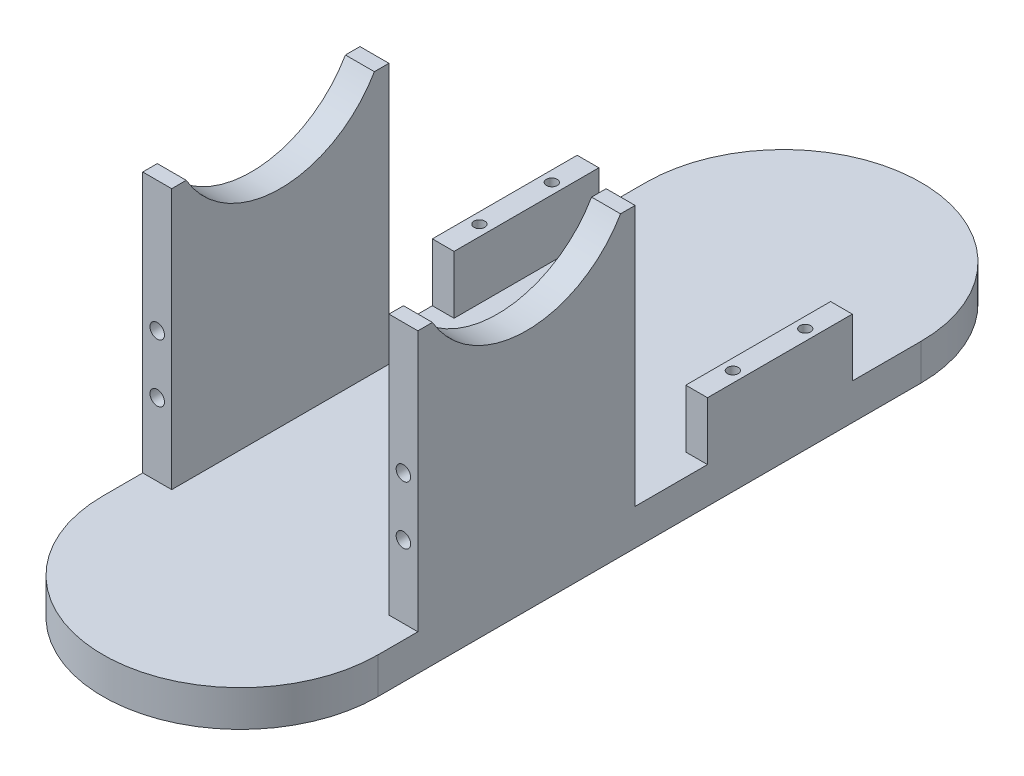
ISO-10303-21;
HEADER;
FILE_DESCRIPTION(('STEP AP214'),'2;1');
FILE_NAME('part.step','',(''),(''),'','','');
FILE_SCHEMA(('AUTOMOTIVE_DESIGN { 1 0 10303 214 1 1 1 1 }'));
ENDSEC;
DATA;
#1=APPLICATION_CONTEXT('core data for automotive mechanical design processes');
#2=APPLICATION_PROTOCOL_DEFINITION('international standard','automotive_design',2000,#1);
#3=PRODUCT_CONTEXT('',#1,'mechanical');
#4=PRODUCT('Part','Part','',(#3));
#5=PRODUCT_RELATED_PRODUCT_CATEGORY('part','',(#4));
#6=PRODUCT_DEFINITION_FORMATION('','',#4);
#7=PRODUCT_DEFINITION_CONTEXT('part definition',#1,'design');
#8=PRODUCT_DEFINITION('design','',#6,#7);
#9=PRODUCT_DEFINITION_SHAPE('','',#8);
#10=(LENGTH_UNIT() NAMED_UNIT(*) SI_UNIT(.MILLI.,.METRE.));
#11=(NAMED_UNIT(*) PLANE_ANGLE_UNIT() SI_UNIT($,.RADIAN.));
#12=(NAMED_UNIT(*) SI_UNIT($,.STERADIAN.) SOLID_ANGLE_UNIT());
#13=UNCERTAINTY_MEASURE_WITH_UNIT(LENGTH_MEASURE(1.E-05),#10,'distance_accuracy_value','');
#14=(GEOMETRIC_REPRESENTATION_CONTEXT(3) GLOBAL_UNCERTAINTY_ASSIGNED_CONTEXT((#13)) GLOBAL_UNIT_ASSIGNED_CONTEXT((#10,
#11,#12)) REPRESENTATION_CONTEXT('',''));
#15=CARTESIAN_POINT('',(0.,0.,0.));
#16=DIRECTION('',(0.,0.,1.));
#17=DIRECTION('',(1.,0.,0.));
#18=AXIS2_PLACEMENT_3D('',#15,#16,#17);
#19=CARTESIAN_POINT('',(0.,82.,0.));
#20=DIRECTION('',(0.,-1.,0.));
#21=DIRECTION('',(0.,0.,-1.));
#22=AXIS2_PLACEMENT_3D('',#19,#20,#21);
#23=PLANE('',#22);
#24=DIRECTION('',(0.,0.,1.));
#25=VECTOR('',#24,1.);
#26=CARTESIAN_POINT('',(-38.,82.,64.));
#27=LINE('',#26,#25);
#28=CARTESIAN_POINT('',(-38.,82.,4.));
#29=VERTEX_POINT('',#28);
#30=CARTESIAN_POINT('',(-38.0000000000001,82.,8.01923788646687));
#31=VERTEX_POINT('',#30);
#32=EDGE_CURVE('E245',#29,#31,#27,.T.);
#33=ORIENTED_EDGE('',*,*,#32,.T.);
#34=DIRECTION('',(1.,0.,0.));
#35=VECTOR('',#34,1.);
#36=CARTESIAN_POINT('',(-38.0000000000001,82.,8.01923788646687));
#37=LINE('',#36,#35);
#38=CARTESIAN_POINT('',(-30.,82.,8.01923788646687));
#39=VERTEX_POINT('',#38);
#40=EDGE_CURVE('E470',#31,#39,#37,.T.);
#41=ORIENTED_EDGE('',*,*,#40,.T.);
#42=DIRECTION('',(0.,0.,-1.));
#43=VECTOR('',#42,1.);
#44=CARTESIAN_POINT('',(-30.,82.,64.));
#45=LINE('',#44,#43);
#46=CARTESIAN_POINT('',(-30.,82.,4.));
#47=VERTEX_POINT('',#46);
#48=EDGE_CURVE('E251',#39,#47,#45,.T.);
#49=ORIENTED_EDGE('',*,*,#48,.T.);
#50=DIRECTION('',(-1.,0.,0.));
#51=VECTOR('',#50,1.);
#52=CARTESIAN_POINT('',(-38.,82.,4.));
#53=LINE('',#52,#51);
#54=EDGE_CURVE('E255',#47,#29,#53,.T.);
#55=ORIENTED_EDGE('',*,*,#54,.T.);
#56=EDGE_LOOP('',(#33,#41,#49,#55));
#57=FACE_BOUND('',#56,.T.);
#58=ADVANCED_FACE('F38',(#57),#23,.F.);
#59=CARTESIAN_POINT('',(0.,82.,0.));
#60=DIRECTION('',(0.,1.,0.));
#61=DIRECTION('',(0.,0.,1.));
#62=AXIS2_PLACEMENT_3D('',#59,#60,#61);
#63=PLANE('',#62);
#64=DIRECTION('',(1.,0.,0.));
#65=VECTOR('',#64,1.);
#66=CARTESIAN_POINT('',(-38.0000000000001,82.,59.9807621135332));
#67=LINE('',#66,#65);
#68=CARTESIAN_POINT('',(30.,82.,59.9807621135332));
#69=VERTEX_POINT('',#68);
#70=CARTESIAN_POINT('',(38.,82.,59.9807621135332));
#71=VERTEX_POINT('',#70);
#72=EDGE_CURVE('E11',#69,#71,#67,.T.);
#73=ORIENTED_EDGE('',*,*,#72,.F.);
#74=DIRECTION('',(0.,0.,1.));
#75=VECTOR('',#74,1.);
#76=CARTESIAN_POINT('',(30.,82.,64.));
#77=LINE('',#76,#75);
#78=CARTESIAN_POINT('',(30.,82.,64.));
#79=VERTEX_POINT('',#78);
#80=EDGE_CURVE('E218',#69,#79,#77,.T.);
#81=ORIENTED_EDGE('',*,*,#80,.T.);
#82=DIRECTION('',(1.,0.,0.));
#83=VECTOR('',#82,1.);
#84=CARTESIAN_POINT('',(38.,82.,64.));
#85=LINE('',#84,#83);
#86=CARTESIAN_POINT('',(38.,82.,64.));
#87=VERTEX_POINT('',#86);
#88=EDGE_CURVE('E214',#79,#87,#85,.T.);
#89=ORIENTED_EDGE('',*,*,#88,.T.);
#90=DIRECTION('',(0.,0.,-1.));
#91=VECTOR('',#90,1.);
#92=CARTESIAN_POINT('',(38.,82.,64.));
#93=LINE('',#92,#91);
#94=EDGE_CURVE('E207',#87,#71,#93,.T.);
#95=ORIENTED_EDGE('',*,*,#94,.T.);
#96=EDGE_LOOP('',(#73,#81,#89,#95));
#97=FACE_BOUND('',#96,.T.);
#98=ADVANCED_FACE('F212',(#97),#63,.T.);
#99=CARTESIAN_POINT('',(0.,10.,75.));
#100=DIRECTION('',(0.,1.,0.));
#101=DIRECTION('',(0.,0.,1.));
#102=AXIS2_PLACEMENT_3D('',#99,#100,#101);
#103=PLANE('',#102);
#104=DIRECTION('',(0.,0.,1.));
#105=VECTOR('',#104,1.);
#106=CARTESIAN_POINT('',(32.,10.,-16.));
#107=LINE('',#106,#105);
#108=CARTESIAN_POINT('',(32.,10.,-56.));
#109=VERTEX_POINT('',#108);
#110=CARTESIAN_POINT('',(32.,10.,-16.));
#111=VERTEX_POINT('',#110);
#112=EDGE_CURVE('E367',#109,#111,#107,.T.);
#113=ORIENTED_EDGE('',*,*,#112,.F.);
#114=DIRECTION('',(-1.,0.,0.));
#115=VECTOR('',#114,1.);
#116=CARTESIAN_POINT('',(38.,10.,-56.));
#117=LINE('',#116,#115);
#118=CARTESIAN_POINT('',(38.,10.,-56.));
#119=VERTEX_POINT('',#118);
#120=EDGE_CURVE('E350',#119,#109,#117,.T.);
#121=ORIENTED_EDGE('',*,*,#120,.F.);
#122=DIRECTION('',(0.,0.,-1.));
#123=VECTOR('',#122,1.);
#124=CARTESIAN_POINT('',(38.,10.,75.));
#125=LINE('',#124,#123);
#126=CARTESIAN_POINT('',(37.9999999999999,10.,-75.));
#127=VERTEX_POINT('',#126);
#128=EDGE_CURVE('E281',#119,#127,#125,.T.);
#129=ORIENTED_EDGE('',*,*,#128,.T.);
#130=CARTESIAN_POINT('',(0.,10.,-75.));
#131=DIRECTION('',(0.,1.,0.));
#132=DIRECTION('',(0.,0.,1.));
#133=AXIS2_PLACEMENT_3D('',#130,#131,#132);
#134=CIRCLE('',#133,38.);
#135=CARTESIAN_POINT('',(-38.,10.,-75.));
#136=VERTEX_POINT('',#135);
#137=EDGE_CURVE('E286',#127,#136,#134,.T.);
#138=ORIENTED_EDGE('',*,*,#137,.T.);
#139=DIRECTION('',(0.,0.,1.));
#140=VECTOR('',#139,1.);
#141=CARTESIAN_POINT('',(-38.,10.,75.));
#142=LINE('',#141,#140);
#143=CARTESIAN_POINT('',(-38.,10.,-56.));
#144=VERTEX_POINT('',#143);
#145=EDGE_CURVE('E290',#136,#144,#142,.T.);
#146=ORIENTED_EDGE('',*,*,#145,.T.);
#147=DIRECTION('',(-1.,0.,0.));
#148=VECTOR('',#147,1.);
#149=CARTESIAN_POINT('',(-38.,10.,-56.));
#150=LINE('',#149,#148);
#151=CARTESIAN_POINT('',(-32.,10.,-56.));
#152=VERTEX_POINT('',#151);
#153=EDGE_CURVE('E387',#152,#144,#150,.T.);
#154=ORIENTED_EDGE('',*,*,#153,.F.);
#155=DIRECTION('',(0.,0.,-1.));
#156=VECTOR('',#155,1.);
#157=CARTESIAN_POINT('',(-32.,10.,-16.));
#158=LINE('',#157,#156);
#159=CARTESIAN_POINT('',(-32.,10.,-16.));
#160=VERTEX_POINT('',#159);
#161=EDGE_CURVE('E396',#160,#152,#158,.T.);
#162=ORIENTED_EDGE('',*,*,#161,.F.);
#163=DIRECTION('',(1.,0.,0.));
#164=VECTOR('',#163,1.);
#165=CARTESIAN_POINT('',(-38.,10.,-16.));
#166=LINE('',#165,#164);
#167=CARTESIAN_POINT('',(-38.,10.,-16.));
#168=VERTEX_POINT('',#167);
#169=EDGE_CURVE('E382',#168,#160,#166,.T.);
#170=ORIENTED_EDGE('',*,*,#169,.F.);
#171=CARTESIAN_POINT('',(-38.,10.,4.));
#172=VERTEX_POINT('',#171);
#173=EDGE_CURVE('E293',#168,#172,#142,.T.);
#174=ORIENTED_EDGE('',*,*,#173,.T.);
#175=DIRECTION('',(-1.,0.,0.));
#176=VECTOR('',#175,1.);
#177=CARTESIAN_POINT('',(-38.,10.,4.));
#178=LINE('',#177,#176);
#179=CARTESIAN_POINT('',(-30.,10.,4.));
#180=VERTEX_POINT('',#179);
#181=EDGE_CURVE('E263',#180,#172,#178,.T.);
#182=ORIENTED_EDGE('',*,*,#181,.F.);
#183=DIRECTION('',(0.,0.,-1.));
#184=VECTOR('',#183,1.);
#185=CARTESIAN_POINT('',(-30.,10.,64.));
#186=LINE('',#185,#184);
#187=CARTESIAN_POINT('',(-30.,10.,64.));
#188=VERTEX_POINT('',#187);
#189=EDGE_CURVE('E260',#188,#180,#186,.T.);
#190=ORIENTED_EDGE('',*,*,#189,.F.);
#191=DIRECTION('',(1.,0.,0.));
#192=VECTOR('',#191,1.);
#193=CARTESIAN_POINT('',(-38.,10.,64.));
#194=LINE('',#193,#192);
#195=CARTESIAN_POINT('',(-38.,10.,64.));
#196=VERTEX_POINT('',#195);
#197=EDGE_CURVE('E244',#196,#188,#194,.T.);
#198=ORIENTED_EDGE('',*,*,#197,.F.);
#199=CARTESIAN_POINT('',(-38.,10.,75.));
#200=VERTEX_POINT('',#199);
#201=EDGE_CURVE('E289',#196,#200,#142,.T.);
#202=ORIENTED_EDGE('',*,*,#201,.T.);
#203=CARTESIAN_POINT('',(0.,10.,75.));
#204=DIRECTION('',(0.,1.,0.));
#205=DIRECTION('',(0.,0.,1.));
#206=AXIS2_PLACEMENT_3D('',#203,#204,#205);
#207=CIRCLE('',#206,38.);
#208=CARTESIAN_POINT('',(38.,10.,75.));
#209=VERTEX_POINT('',#208);
#210=EDGE_CURVE('E278',#200,#209,#207,.T.);
#211=ORIENTED_EDGE('',*,*,#210,.T.);
#212=CARTESIAN_POINT('',(38.,10.,64.));
#213=VERTEX_POINT('',#212);
#214=EDGE_CURVE('E283',#209,#213,#125,.T.);
#215=ORIENTED_EDGE('',*,*,#214,.T.);
#216=DIRECTION('',(1.,0.,0.));
#217=VECTOR('',#216,1.);
#218=CARTESIAN_POINT('',(38.,10.,64.));
#219=LINE('',#218,#217);
#220=CARTESIAN_POINT('',(30.,10.,64.));
#221=VERTEX_POINT('',#220);
#222=EDGE_CURVE('E220',#221,#213,#219,.T.);
#223=ORIENTED_EDGE('',*,*,#222,.F.);
#224=DIRECTION('',(0.,0.,1.));
#225=VECTOR('',#224,1.);
#226=CARTESIAN_POINT('',(30.,10.,64.));
#227=LINE('',#226,#225);
#228=CARTESIAN_POINT('',(30.,10.,4.00000000000001));
#229=VERTEX_POINT('',#228);
#230=EDGE_CURVE('E232',#229,#221,#227,.T.);
#231=ORIENTED_EDGE('',*,*,#230,.F.);
#232=DIRECTION('',(-1.,0.,0.));
#233=VECTOR('',#232,1.);
#234=CARTESIAN_POINT('',(38.,10.,4.));
#235=LINE('',#234,#233);
#236=CARTESIAN_POINT('',(38.,10.,4.));
#237=VERTEX_POINT('',#236);
#238=EDGE_CURVE('E230',#237,#229,#235,.T.);
#239=ORIENTED_EDGE('',*,*,#238,.F.);
#240=CARTESIAN_POINT('',(38.,10.,-16.));
#241=VERTEX_POINT('',#240);
#242=EDGE_CURVE('E287',#237,#241,#125,.T.);
#243=ORIENTED_EDGE('',*,*,#242,.T.);
#244=DIRECTION('',(1.,0.,0.));
#245=VECTOR('',#244,1.);
#246=CARTESIAN_POINT('',(38.,10.,-16.));
#247=LINE('',#246,#245);
#248=EDGE_CURVE('E354',#111,#241,#247,.T.);
#249=ORIENTED_EDGE('',*,*,#248,.F.);
#250=EDGE_LOOP('',(#113,#121,#129,#138,#146,#154,#162,#170,#174,#182,#190,#198,#202,#211,#215,
#223,#231,#239,#243,#249));
#251=FACE_BOUND('',#250,.T.);
#252=ADVANCED_FACE('F327',(#251),#103,.T.);
#253=CARTESIAN_POINT('',(0.,10.,75.));
#254=DIRECTION('',(0.,-1.,0.));
#255=DIRECTION('',(0.,0.,-1.));
#256=AXIS2_PLACEMENT_3D('',#253,#254,#255);
#257=CYLINDRICAL_SURFACE('',#256,38.);
#258=CARTESIAN_POINT('',(0.,0.,75.));
#259=DIRECTION('',(0.,1.,0.));
#260=DIRECTION('',(0.,0.,1.));
#261=AXIS2_PLACEMENT_3D('',#258,#259,#260);
#262=CIRCLE('',#261,38.);
#263=CARTESIAN_POINT('',(-38.,0.,75.));
#264=VERTEX_POINT('',#263);
#265=CARTESIAN_POINT('',(38.,0.,75.));
#266=VERTEX_POINT('',#265);
#267=EDGE_CURVE('E277',#264,#266,#262,.T.);
#268=ORIENTED_EDGE('',*,*,#267,.T.);
#269=DIRECTION('',(0.,-1.,0.));
#270=VECTOR('',#269,1.);
#271=CARTESIAN_POINT('',(38.,10.,75.));
#272=LINE('',#271,#270);
#273=EDGE_CURVE('E309',#209,#266,#272,.T.);
#274=ORIENTED_EDGE('',*,*,#273,.F.);
#275=ORIENTED_EDGE('',*,*,#210,.F.);
#276=DIRECTION('',(0.,-1.,0.));
#277=VECTOR('',#276,1.);
#278=CARTESIAN_POINT('',(-38.,10.,75.));
#279=LINE('',#278,#277);
#280=EDGE_CURVE('E292',#200,#264,#279,.T.);
#281=ORIENTED_EDGE('',*,*,#280,.T.);
#282=EDGE_LOOP('',(#268,#274,#275,#281));
#283=FACE_BOUND('',#282,.T.);
#284=ADVANCED_FACE('F40',(#283),#257,.T.);
#285=CARTESIAN_POINT('',(38.,10.,75.));
#286=DIRECTION('',(-1.,0.,0.));
#287=DIRECTION('',(0.,0.,1.));
#288=AXIS2_PLACEMENT_3D('',#285,#286,#287);
#289=PLANE('',#288);
#290=CARTESIAN_POINT('',(38.,82.,8.01923788646684));
#291=VERTEX_POINT('',#290);
#292=CARTESIAN_POINT('',(38.,82.,4.));
#293=VERTEX_POINT('',#292);
#294=EDGE_CURVE('E209',#291,#293,#93,.T.);
#295=ORIENTED_EDGE('',*,*,#294,.F.);
#296=CARTESIAN_POINT('',(38.,97.,34.));
#297=DIRECTION('',(1.,0.,0.));
#298=DIRECTION('',(0.,0.,-1.));
#299=AXIS2_PLACEMENT_3D('',#296,#297,#298);
#300=CIRCLE('',#299,30.);
#301=EDGE_CURVE('E60',#71,#291,#300,.T.);
#302=ORIENTED_EDGE('',*,*,#301,.F.);
#303=ORIENTED_EDGE('',*,*,#94,.F.);
#304=DIRECTION('',(0.,-1.,0.));
#305=VECTOR('',#304,1.);
#306=CARTESIAN_POINT('',(38.,82.,64.));
#307=LINE('',#306,#305);
#308=EDGE_CURVE('E229',#87,#213,#307,.T.);
#309=ORIENTED_EDGE('',*,*,#308,.T.);
#310=ORIENTED_EDGE('',*,*,#214,.F.);
#311=ORIENTED_EDGE('',*,*,#273,.T.);
#312=DIRECTION('',(0.,0.,-1.));
#313=VECTOR('',#312,1.);
#314=CARTESIAN_POINT('',(38.,0.,75.));
#315=LINE('',#314,#313);
#316=CARTESIAN_POINT('',(37.9999999999999,0.,-75.));
#317=VERTEX_POINT('',#316);
#318=EDGE_CURVE('E296',#266,#317,#315,.T.);
#319=ORIENTED_EDGE('',*,*,#318,.T.);
#320=DIRECTION('',(0.,-1.,0.));
#321=VECTOR('',#320,1.);
#322=CARTESIAN_POINT('',(37.9999999999999,10.,-75.));
#323=LINE('',#322,#321);
#324=EDGE_CURVE('E306',#127,#317,#323,.T.);
#325=ORIENTED_EDGE('',*,*,#324,.F.);
#326=ORIENTED_EDGE('',*,*,#128,.F.);
#327=DIRECTION('',(0.,-1.,0.));
#328=VECTOR('',#327,1.);
#329=CARTESIAN_POINT('',(38.,26.,-56.));
#330=LINE('',#329,#328);
#331=CARTESIAN_POINT('',(38.,26.,-56.));
#332=VERTEX_POINT('',#331);
#333=EDGE_CURVE('E380',#332,#119,#330,.T.);
#334=ORIENTED_EDGE('',*,*,#333,.F.);
#335=DIRECTION('',(0.,0.,-1.));
#336=VECTOR('',#335,1.);
#337=CARTESIAN_POINT('',(38.,26.,-16.));
#338=LINE('',#337,#336);
#339=CARTESIAN_POINT('',(38.,26.,-16.));
#340=VERTEX_POINT('',#339);
#341=EDGE_CURVE('E366',#340,#332,#338,.T.);
#342=ORIENTED_EDGE('',*,*,#341,.F.);
#343=DIRECTION('',(0.,-1.,0.));
#344=VECTOR('',#343,1.);
#345=CARTESIAN_POINT('',(38.,26.,-16.));
#346=LINE('',#345,#344);
#347=EDGE_CURVE('E362',#340,#241,#346,.T.);
#348=ORIENTED_EDGE('',*,*,#347,.T.);
#349=ORIENTED_EDGE('',*,*,#242,.F.);
#350=DIRECTION('',(0.,-1.,0.));
#351=VECTOR('',#350,1.);
#352=CARTESIAN_POINT('',(38.,82.,4.));
#353=LINE('',#352,#351);
#354=EDGE_CURVE('E242',#293,#237,#353,.T.);
#355=ORIENTED_EDGE('',*,*,#354,.F.);
#356=EDGE_LOOP('',(#295,#302,#303,#309,#310,#311,#319,#325,#326,#334,#342,#348,#349,#355));
#357=FACE_BOUND('',#356,.T.);
#358=ADVANCED_FACE('F205',(#357),#289,.F.);
#359=CARTESIAN_POINT('',(0.,10.,-75.));
#360=DIRECTION('',(0.,-1.,0.));
#361=DIRECTION('',(0.,0.,-1.));
#362=AXIS2_PLACEMENT_3D('',#359,#360,#361);
#363=CYLINDRICAL_SURFACE('',#362,38.);
#364=CARTESIAN_POINT('',(0.,0.,-75.));
#365=DIRECTION('',(0.,1.,0.));
#366=DIRECTION('',(0.,0.,1.));
#367=AXIS2_PLACEMENT_3D('',#364,#365,#366);
#368=CIRCLE('',#367,38.);
#369=CARTESIAN_POINT('',(-38.,0.,-75.));
#370=VERTEX_POINT('',#369);
#371=EDGE_CURVE('E298',#317,#370,#368,.T.);
#372=ORIENTED_EDGE('',*,*,#371,.T.);
#373=DIRECTION('',(0.,-1.,0.));
#374=VECTOR('',#373,1.);
#375=CARTESIAN_POINT('',(-38.,10.,-75.));
#376=LINE('',#375,#374);
#377=EDGE_CURVE('E303',#136,#370,#376,.T.);
#378=ORIENTED_EDGE('',*,*,#377,.F.);
#379=ORIENTED_EDGE('',*,*,#137,.F.);
#380=ORIENTED_EDGE('',*,*,#324,.T.);
#381=EDGE_LOOP('',(#372,#378,#379,#380));
#382=FACE_BOUND('',#381,.T.);
#383=ADVANCED_FACE('F344',(#382),#363,.T.);
#384=CARTESIAN_POINT('',(-38.,10.,75.));
#385=DIRECTION('',(1.,0.,0.));
#386=DIRECTION('',(0.,0.,-1.));
#387=AXIS2_PLACEMENT_3D('',#384,#385,#386);
#388=PLANE('',#387);
#389=CARTESIAN_POINT('',(-38.,82.,59.9807621135332));
#390=VERTEX_POINT('',#389);
#391=CARTESIAN_POINT('',(-38.,82.,64.));
#392=VERTEX_POINT('',#391);
#393=EDGE_CURVE('E249',#390,#392,#27,.T.);
#394=ORIENTED_EDGE('',*,*,#393,.F.);
#395=CARTESIAN_POINT('',(-38.0000000000001,97.,34.));
#396=DIRECTION('',(1.,0.,0.));
#397=DIRECTION('',(0.,0.,-1.));
#398=AXIS2_PLACEMENT_3D('',#395,#396,#397);
#399=CIRCLE('',#398,30.);
#400=EDGE_CURVE('E53',#390,#31,#399,.T.);
#401=ORIENTED_EDGE('',*,*,#400,.T.);
#402=ORIENTED_EDGE('',*,*,#32,.F.);
#403=DIRECTION('',(0.,-1.,0.));
#404=VECTOR('',#403,1.);
#405=CARTESIAN_POINT('',(-38.,82.,4.));
#406=LINE('',#405,#404);
#407=EDGE_CURVE('E257',#29,#172,#406,.T.);
#408=ORIENTED_EDGE('',*,*,#407,.T.);
#409=ORIENTED_EDGE('',*,*,#173,.F.);
#410=DIRECTION('',(0.,-1.,0.));
#411=VECTOR('',#410,1.);
#412=CARTESIAN_POINT('',(-38.,26.,-16.));
#413=LINE('',#412,#411);
#414=CARTESIAN_POINT('',(-38.,26.,-16.));
#415=VERTEX_POINT('',#414);
#416=EDGE_CURVE('E222',#415,#168,#413,.T.);
#417=ORIENTED_EDGE('',*,*,#416,.F.);
#418=DIRECTION('',(0.,0.,1.));
#419=VECTOR('',#418,1.);
#420=CARTESIAN_POINT('',(-38.,26.,-16.));
#421=LINE('',#420,#419);
#422=CARTESIAN_POINT('',(-38.,26.,-56.));
#423=VERTEX_POINT('',#422);
#424=EDGE_CURVE('E383',#423,#415,#421,.T.);
#425=ORIENTED_EDGE('',*,*,#424,.F.);
#426=DIRECTION('',(0.,-1.,0.));
#427=VECTOR('',#426,1.);
#428=CARTESIAN_POINT('',(-38.,26.,-56.));
#429=LINE('',#428,#427);
#430=EDGE_CURVE('E393',#423,#144,#429,.T.);
#431=ORIENTED_EDGE('',*,*,#430,.T.);
#432=ORIENTED_EDGE('',*,*,#145,.F.);
#433=ORIENTED_EDGE('',*,*,#377,.T.);
#434=DIRECTION('',(0.,0.,1.));
#435=VECTOR('',#434,1.);
#436=CARTESIAN_POINT('',(-38.,0.,75.));
#437=LINE('',#436,#435);
#438=EDGE_CURVE('E282',#370,#264,#437,.T.);
#439=ORIENTED_EDGE('',*,*,#438,.T.);
#440=ORIENTED_EDGE('',*,*,#280,.F.);
#441=ORIENTED_EDGE('',*,*,#201,.F.);
#442=DIRECTION('',(0.,-1.,0.));
#443=VECTOR('',#442,1.);
#444=CARTESIAN_POINT('',(-38.,82.,64.));
#445=LINE('',#444,#443);
#446=EDGE_CURVE('E274',#392,#196,#445,.T.);
#447=ORIENTED_EDGE('',*,*,#446,.F.);
#448=EDGE_LOOP('',(#394,#401,#402,#408,#409,#417,#425,#431,#432,#433,#439,#440,#441,#447));
#449=FACE_BOUND('',#448,.T.);
#450=ADVANCED_FACE('F417',(#449),#388,.F.);
#451=CARTESIAN_POINT('',(0.,0.,75.));
#452=DIRECTION('',(0.,1.,0.));
#453=DIRECTION('',(0.,0.,1.));
#454=AXIS2_PLACEMENT_3D('',#451,#452,#453);
#455=PLANE('',#454);
#456=ORIENTED_EDGE('',*,*,#267,.F.);
#457=ORIENTED_EDGE('',*,*,#438,.F.);
#458=ORIENTED_EDGE('',*,*,#371,.F.);
#459=ORIENTED_EDGE('',*,*,#318,.F.);
#460=EDGE_LOOP('',(#456,#457,#458,#459));
#461=FACE_BOUND('',#460,.T.);
#462=ADVANCED_FACE('F339',(#461),#455,.F.);
#463=CARTESIAN_POINT('',(-38.,82.,64.));
#464=DIRECTION('',(0.,0.,-1.));
#465=DIRECTION('',(-1.,0.,0.));
#466=AXIS2_PLACEMENT_3D('',#463,#464,#465);
#467=PLANE('',#466);
#468=CARTESIAN_POINT('',(-34.,30.,64.));
#469=DIRECTION('',(0.,0.,1.));
#470=DIRECTION('',(1.,0.,0.));
#471=AXIS2_PLACEMENT_3D('',#468,#469,#470);
#472=CIRCLE('',#471,2.);
#473=CARTESIAN_POINT('',(-32.,30.,64.));
#474=VERTEX_POINT('',#473);
#475=EDGE_CURVE('E810',#474,#474,#472,.T.);
#476=ORIENTED_EDGE('',*,*,#475,.F.);
#477=EDGE_LOOP('',(#476));
#478=FACE_BOUND('',#477,.T.);
#479=CARTESIAN_POINT('',(-34.,46.,64.));
#480=DIRECTION('',(0.,0.,1.));
#481=DIRECTION('',(1.,0.,0.));
#482=AXIS2_PLACEMENT_3D('',#479,#480,#481);
#483=CIRCLE('',#482,2.);
#484=CARTESIAN_POINT('',(-32.,46.,64.));
#485=VERTEX_POINT('',#484);
#486=EDGE_CURVE('E809',#485,#485,#483,.T.);
#487=ORIENTED_EDGE('',*,*,#486,.F.);
#488=EDGE_LOOP('',(#487));
#489=FACE_BOUND('',#488,.T.);
#490=ORIENTED_EDGE('',*,*,#197,.T.);
#491=DIRECTION('',(0.,-1.,0.));
#492=VECTOR('',#491,1.);
#493=CARTESIAN_POINT('',(-30.,82.,64.));
#494=LINE('',#493,#492);
#495=CARTESIAN_POINT('',(-30.,82.,64.));
#496=VERTEX_POINT('',#495);
#497=EDGE_CURVE('E271',#496,#188,#494,.T.);
#498=ORIENTED_EDGE('',*,*,#497,.F.);
#499=DIRECTION('',(1.,0.,0.));
#500=VECTOR('',#499,1.);
#501=CARTESIAN_POINT('',(-38.,82.,64.));
#502=LINE('',#501,#500);
#503=EDGE_CURVE('E248',#392,#496,#502,.T.);
#504=ORIENTED_EDGE('',*,*,#503,.F.);
#505=ORIENTED_EDGE('',*,*,#446,.T.);
#506=EDGE_LOOP('',(#490,#498,#504,#505));
#507=FACE_BOUND('',#506,.T.);
#508=ADVANCED_FACE('F550',(#478,#489,#507),#467,.F.);
#509=CARTESIAN_POINT('',(-30.,82.,64.));
#510=DIRECTION('',(-1.,0.,0.));
#511=DIRECTION('',(0.,0.,1.));
#512=AXIS2_PLACEMENT_3D('',#509,#510,#511);
#513=PLANE('',#512);
#514=ORIENTED_EDGE('',*,*,#48,.F.);
#515=CARTESIAN_POINT('',(-30.,97.,34.));
#516=DIRECTION('',(-1.,0.,0.));
#517=DIRECTION('',(0.,0.,1.));
#518=AXIS2_PLACEMENT_3D('',#515,#516,#517);
#519=CIRCLE('',#518,30.);
#520=CARTESIAN_POINT('',(-30.,82.,59.9807621135332));
#521=VERTEX_POINT('',#520);
#522=EDGE_CURVE('E467',#39,#521,#519,.T.);
#523=ORIENTED_EDGE('',*,*,#522,.T.);
#524=EDGE_CURVE('E252',#496,#521,#45,.T.);
#525=ORIENTED_EDGE('',*,*,#524,.F.);
#526=ORIENTED_EDGE('',*,*,#497,.T.);
#527=ORIENTED_EDGE('',*,*,#189,.T.);
#528=DIRECTION('',(0.,-1.,0.));
#529=VECTOR('',#528,1.);
#530=CARTESIAN_POINT('',(-30.,82.,4.));
#531=LINE('',#530,#529);
#532=EDGE_CURVE('E268',#47,#180,#531,.T.);
#533=ORIENTED_EDGE('',*,*,#532,.F.);
#534=EDGE_LOOP('',(#514,#523,#525,#526,#527,#533));
#535=FACE_BOUND('',#534,.T.);
#536=ADVANCED_FACE('F459',(#535),#513,.F.);
#537=CARTESIAN_POINT('',(-38.,82.,4.));
#538=DIRECTION('',(0.,0.,1.));
#539=DIRECTION('',(1.,0.,0.));
#540=AXIS2_PLACEMENT_3D('',#537,#538,#539);
#541=PLANE('',#540);
#542=ORIENTED_EDGE('',*,*,#181,.T.);
#543=ORIENTED_EDGE('',*,*,#407,.F.);
#544=ORIENTED_EDGE('',*,*,#54,.F.);
#545=ORIENTED_EDGE('',*,*,#532,.T.);
#546=EDGE_LOOP('',(#542,#543,#544,#545));
#547=FACE_BOUND('',#546,.T.);
#548=ADVANCED_FACE('F453',(#547),#541,.F.);
#549=ORIENTED_EDGE('',*,*,#524,.T.);
#550=DIRECTION('',(1.,0.,0.));
#551=VECTOR('',#550,1.);
#552=CARTESIAN_POINT('',(-38.0000000000001,82.,59.9807621135332));
#553=LINE('',#552,#551);
#554=EDGE_CURVE('E316',#521,#390,#553,.F.);
#555=ORIENTED_EDGE('',*,*,#554,.T.);
#556=ORIENTED_EDGE('',*,*,#393,.T.);
#557=ORIENTED_EDGE('',*,*,#503,.T.);
#558=EDGE_LOOP('',(#549,#555,#556,#557));
#559=FACE_BOUND('',#558,.T.);
#560=ADVANCED_FACE('F445',(#559),#23,.F.);
#561=CARTESIAN_POINT('',(38.,82.,4.));
#562=DIRECTION('',(0.,0.,1.));
#563=DIRECTION('',(1.,0.,0.));
#564=AXIS2_PLACEMENT_3D('',#561,#562,#563);
#565=PLANE('',#564);
#566=ORIENTED_EDGE('',*,*,#238,.T.);
#567=DIRECTION('',(0.,-1.,0.));
#568=VECTOR('',#567,1.);
#569=CARTESIAN_POINT('',(30.,82.,4.00000000000001));
#570=LINE('',#569,#568);
#571=CARTESIAN_POINT('',(30.,82.,4.00000000000001));
#572=VERTEX_POINT('',#571);
#573=EDGE_CURVE('E239',#572,#229,#570,.T.);
#574=ORIENTED_EDGE('',*,*,#573,.F.);
#575=DIRECTION('',(-1.,0.,0.));
#576=VECTOR('',#575,1.);
#577=CARTESIAN_POINT('',(38.,82.,4.));
#578=LINE('',#577,#576);
#579=EDGE_CURVE('E216',#293,#572,#578,.T.);
#580=ORIENTED_EDGE('',*,*,#579,.F.);
#581=ORIENTED_EDGE('',*,*,#354,.T.);
#582=EDGE_LOOP('',(#566,#574,#580,#581));
#583=FACE_BOUND('',#582,.T.);
#584=ADVANCED_FACE('F322',(#583),#565,.F.);
#585=CARTESIAN_POINT('',(30.,82.,64.));
#586=DIRECTION('',(1.,0.,0.));
#587=DIRECTION('',(0.,0.,-1.));
#588=AXIS2_PLACEMENT_3D('',#585,#586,#587);
#589=PLANE('',#588);
#590=ORIENTED_EDGE('',*,*,#80,.F.);
#591=CARTESIAN_POINT('',(30.,97.,34.));
#592=DIRECTION('',(1.,0.,0.));
#593=DIRECTION('',(0.,0.,-1.));
#594=AXIS2_PLACEMENT_3D('',#591,#592,#593);
#595=CIRCLE('',#594,30.);
#596=CARTESIAN_POINT('',(30.,82.,8.01923788646685));
#597=VERTEX_POINT('',#596);
#598=EDGE_CURVE('E198',#69,#597,#595,.T.);
#599=ORIENTED_EDGE('',*,*,#598,.T.);
#600=EDGE_CURVE('E225',#572,#597,#77,.T.);
#601=ORIENTED_EDGE('',*,*,#600,.F.);
#602=ORIENTED_EDGE('',*,*,#573,.T.);
#603=ORIENTED_EDGE('',*,*,#230,.T.);
#604=DIRECTION('',(0.,-1.,0.));
#605=VECTOR('',#604,1.);
#606=CARTESIAN_POINT('',(30.,82.,64.));
#607=LINE('',#606,#605);
#608=EDGE_CURVE('E237',#79,#221,#607,.T.);
#609=ORIENTED_EDGE('',*,*,#608,.F.);
#610=EDGE_LOOP('',(#590,#599,#601,#602,#603,#609));
#611=FACE_BOUND('',#610,.T.);
#612=ADVANCED_FACE('F314',(#611),#589,.F.);
#613=CARTESIAN_POINT('',(38.,82.,64.));
#614=DIRECTION('',(0.,0.,-1.));
#615=DIRECTION('',(-1.,0.,0.));
#616=AXIS2_PLACEMENT_3D('',#613,#614,#615);
#617=PLANE('',#616);
#618=CARTESIAN_POINT('',(34.,46.,64.));
#619=DIRECTION('',(0.,0.,1.));
#620=DIRECTION('',(1.,0.,0.));
#621=AXIS2_PLACEMENT_3D('',#618,#619,#620);
#622=CIRCLE('',#621,2.);
#623=CARTESIAN_POINT('',(36.,46.,64.));
#624=VERTEX_POINT('',#623);
#625=EDGE_CURVE('E803',#624,#624,#622,.T.);
#626=ORIENTED_EDGE('',*,*,#625,.F.);
#627=EDGE_LOOP('',(#626));
#628=FACE_BOUND('',#627,.T.);
#629=CARTESIAN_POINT('',(34.,30.,64.));
#630=DIRECTION('',(0.,0.,1.));
#631=DIRECTION('',(1.,0.,0.));
#632=AXIS2_PLACEMENT_3D('',#629,#630,#631);
#633=CIRCLE('',#632,2.);
#634=CARTESIAN_POINT('',(36.,30.,64.));
#635=VERTEX_POINT('',#634);
#636=EDGE_CURVE('E798',#635,#635,#633,.T.);
#637=ORIENTED_EDGE('',*,*,#636,.F.);
#638=EDGE_LOOP('',(#637));
#639=FACE_BOUND('',#638,.T.);
#640=ORIENTED_EDGE('',*,*,#222,.T.);
#641=ORIENTED_EDGE('',*,*,#308,.F.);
#642=ORIENTED_EDGE('',*,*,#88,.F.);
#643=ORIENTED_EDGE('',*,*,#608,.T.);
#644=EDGE_LOOP('',(#640,#641,#642,#643));
#645=FACE_BOUND('',#644,.T.);
#646=ADVANCED_FACE('F330',(#628,#639,#645),#617,.F.);
#647=DIRECTION('',(1.,0.,0.));
#648=VECTOR('',#647,1.);
#649=CARTESIAN_POINT('',(-38.0000000000001,82.,8.01923788646687));
#650=LINE('',#649,#648);
#651=EDGE_CURVE('E46',#291,#597,#650,.F.);
#652=ORIENTED_EDGE('',*,*,#651,.F.);
#653=ORIENTED_EDGE('',*,*,#294,.T.);
#654=ORIENTED_EDGE('',*,*,#579,.T.);
#655=ORIENTED_EDGE('',*,*,#600,.T.);
#656=EDGE_LOOP('',(#652,#653,#654,#655));
#657=FACE_BOUND('',#656,.T.);
#658=ADVANCED_FACE('F318',(#657),#63,.T.);
#659=CARTESIAN_POINT('',(-38.,26.,-16.));
#660=DIRECTION('',(0.,0.,-1.));
#661=DIRECTION('',(-1.,0.,0.));
#662=AXIS2_PLACEMENT_3D('',#659,#660,#661);
#663=PLANE('',#662);
#664=ORIENTED_EDGE('',*,*,#169,.T.);
#665=DIRECTION('',(0.,-1.,0.));
#666=VECTOR('',#665,1.);
#667=CARTESIAN_POINT('',(-32.,26.,-16.));
#668=LINE('',#667,#666);
#669=CARTESIAN_POINT('',(-32.,26.,-16.));
#670=VERTEX_POINT('',#669);
#671=EDGE_CURVE('E404',#670,#160,#668,.T.);
#672=ORIENTED_EDGE('',*,*,#671,.F.);
#673=DIRECTION('',(1.,0.,0.));
#674=VECTOR('',#673,1.);
#675=CARTESIAN_POINT('',(-38.,26.,-16.));
#676=LINE('',#675,#674);
#677=EDGE_CURVE('E386',#415,#670,#676,.T.);
#678=ORIENTED_EDGE('',*,*,#677,.F.);
#679=ORIENTED_EDGE('',*,*,#416,.T.);
#680=EDGE_LOOP('',(#664,#672,#678,#679));
#681=FACE_BOUND('',#680,.T.);
#682=ADVANCED_FACE('F412',(#681),#663,.F.);
#683=CARTESIAN_POINT('',(-32.,26.,-16.));
#684=DIRECTION('',(-1.,0.,0.));
#685=DIRECTION('',(0.,0.,1.));
#686=AXIS2_PLACEMENT_3D('',#683,#684,#685);
#687=PLANE('',#686);
#688=ORIENTED_EDGE('',*,*,#161,.T.);
#689=DIRECTION('',(0.,-1.,0.));
#690=VECTOR('',#689,1.);
#691=CARTESIAN_POINT('',(-32.,26.,-56.));
#692=LINE('',#691,#690);
#693=CARTESIAN_POINT('',(-32.,26.,-56.));
#694=VERTEX_POINT('',#693);
#695=EDGE_CURVE('E402',#694,#152,#692,.T.);
#696=ORIENTED_EDGE('',*,*,#695,.F.);
#697=DIRECTION('',(0.,0.,-1.));
#698=VECTOR('',#697,1.);
#699=CARTESIAN_POINT('',(-32.,26.,-16.));
#700=LINE('',#699,#698);
#701=EDGE_CURVE('E389',#670,#694,#700,.T.);
#702=ORIENTED_EDGE('',*,*,#701,.F.);
#703=ORIENTED_EDGE('',*,*,#671,.T.);
#704=EDGE_LOOP('',(#688,#696,#702,#703));
#705=FACE_BOUND('',#704,.T.);
#706=ADVANCED_FACE('F421',(#705),#687,.F.);
#707=CARTESIAN_POINT('',(-38.,26.,-56.));
#708=DIRECTION('',(0.,0.,1.));
#709=DIRECTION('',(1.,0.,0.));
#710=AXIS2_PLACEMENT_3D('',#707,#708,#709);
#711=PLANE('',#710);
#712=ORIENTED_EDGE('',*,*,#153,.T.);
#713=ORIENTED_EDGE('',*,*,#430,.F.);
#714=DIRECTION('',(-1.,0.,0.));
#715=VECTOR('',#714,1.);
#716=CARTESIAN_POINT('',(-38.,26.,-56.));
#717=LINE('',#716,#715);
#718=EDGE_CURVE('E391',#694,#423,#717,.T.);
#719=ORIENTED_EDGE('',*,*,#718,.F.);
#720=ORIENTED_EDGE('',*,*,#695,.T.);
#721=EDGE_LOOP('',(#712,#713,#719,#720));
#722=FACE_BOUND('',#721,.T.);
#723=ADVANCED_FACE('F424',(#722),#711,.F.);
#724=CARTESIAN_POINT('',(0.,26.,0.));
#725=DIRECTION('',(0.,-1.,0.));
#726=DIRECTION('',(0.,0.,-1.));
#727=AXIS2_PLACEMENT_3D('',#724,#725,#726);
#728=PLANE('',#727);
#729=CARTESIAN_POINT('',(-35.,26.,-46.));
#730=DIRECTION('',(0.,1.,0.));
#731=DIRECTION('',(0.,0.,1.));
#732=AXIS2_PLACEMENT_3D('',#729,#730,#731);
#733=CIRCLE('',#732,1.5);
#734=CARTESIAN_POINT('',(-35.,26.,-44.5));
#735=VERTEX_POINT('',#734);
#736=EDGE_CURVE('E779',#735,#735,#733,.T.);
#737=ORIENTED_EDGE('',*,*,#736,.F.);
#738=EDGE_LOOP('',(#737));
#739=FACE_BOUND('',#738,.T.);
#740=CARTESIAN_POINT('',(-35.,26.,-26.));
#741=DIRECTION('',(0.,1.,0.));
#742=DIRECTION('',(0.,0.,1.));
#743=AXIS2_PLACEMENT_3D('',#740,#741,#742);
#744=CIRCLE('',#743,1.5);
#745=CARTESIAN_POINT('',(-35.,26.,-24.5));
#746=VERTEX_POINT('',#745);
#747=EDGE_CURVE('E778',#746,#746,#744,.T.);
#748=ORIENTED_EDGE('',*,*,#747,.F.);
#749=EDGE_LOOP('',(#748));
#750=FACE_BOUND('',#749,.T.);
#751=ORIENTED_EDGE('',*,*,#424,.T.);
#752=ORIENTED_EDGE('',*,*,#677,.T.);
#753=ORIENTED_EDGE('',*,*,#701,.T.);
#754=ORIENTED_EDGE('',*,*,#718,.T.);
#755=EDGE_LOOP('',(#751,#752,#753,#754));
#756=FACE_BOUND('',#755,.T.);
#757=ADVANCED_FACE('F427',(#739,#750,#756),#728,.F.);
#758=CARTESIAN_POINT('',(38.,26.,-56.));
#759=DIRECTION('',(0.,0.,1.));
#760=DIRECTION('',(1.,0.,0.));
#761=AXIS2_PLACEMENT_3D('',#758,#759,#760);
#762=PLANE('',#761);
#763=ORIENTED_EDGE('',*,*,#120,.T.);
#764=DIRECTION('',(0.,-1.,0.));
#765=VECTOR('',#764,1.);
#766=CARTESIAN_POINT('',(32.,26.,-56.));
#767=LINE('',#766,#765);
#768=CARTESIAN_POINT('',(32.,26.,-56.));
#769=VERTEX_POINT('',#768);
#770=EDGE_CURVE('E372',#769,#109,#767,.T.);
#771=ORIENTED_EDGE('',*,*,#770,.F.);
#772=DIRECTION('',(-1.,0.,0.));
#773=VECTOR('',#772,1.);
#774=CARTESIAN_POINT('',(38.,26.,-56.));
#775=LINE('',#774,#773);
#776=EDGE_CURVE('E476',#332,#769,#775,.T.);
#777=ORIENTED_EDGE('',*,*,#776,.F.);
#778=ORIENTED_EDGE('',*,*,#333,.T.);
#779=EDGE_LOOP('',(#763,#771,#777,#778));
#780=FACE_BOUND('',#779,.T.);
#781=ADVANCED_FACE('F429',(#780),#762,.F.);
#782=CARTESIAN_POINT('',(32.,26.,-16.));
#783=DIRECTION('',(1.,0.,0.));
#784=DIRECTION('',(0.,0.,-1.));
#785=AXIS2_PLACEMENT_3D('',#782,#783,#784);
#786=PLANE('',#785);
#787=ORIENTED_EDGE('',*,*,#112,.T.);
#788=DIRECTION('',(0.,-1.,0.));
#789=VECTOR('',#788,1.);
#790=CARTESIAN_POINT('',(32.,26.,-16.));
#791=LINE('',#790,#789);
#792=CARTESIAN_POINT('',(32.,26.,-16.));
#793=VERTEX_POINT('',#792);
#794=EDGE_CURVE('E365',#793,#111,#791,.T.);
#795=ORIENTED_EDGE('',*,*,#794,.F.);
#796=DIRECTION('',(0.,0.,1.));
#797=VECTOR('',#796,1.);
#798=CARTESIAN_POINT('',(32.,26.,-16.));
#799=LINE('',#798,#797);
#800=EDGE_CURVE('E374',#769,#793,#799,.T.);
#801=ORIENTED_EDGE('',*,*,#800,.F.);
#802=ORIENTED_EDGE('',*,*,#770,.T.);
#803=EDGE_LOOP('',(#787,#795,#801,#802));
#804=FACE_BOUND('',#803,.T.);
#805=ADVANCED_FACE('F436',(#804),#786,.F.);
#806=CARTESIAN_POINT('',(38.,26.,-16.));
#807=DIRECTION('',(0.,0.,-1.));
#808=DIRECTION('',(-1.,0.,0.));
#809=AXIS2_PLACEMENT_3D('',#806,#807,#808);
#810=PLANE('',#809);
#811=ORIENTED_EDGE('',*,*,#248,.T.);
#812=ORIENTED_EDGE('',*,*,#347,.F.);
#813=DIRECTION('',(1.,0.,0.));
#814=VECTOR('',#813,1.);
#815=CARTESIAN_POINT('',(38.,26.,-16.));
#816=LINE('',#815,#814);
#817=EDGE_CURVE('E370',#793,#340,#816,.T.);
#818=ORIENTED_EDGE('',*,*,#817,.F.);
#819=ORIENTED_EDGE('',*,*,#794,.T.);
#820=EDGE_LOOP('',(#811,#812,#818,#819));
#821=FACE_BOUND('',#820,.T.);
#822=ADVANCED_FACE('F360',(#821),#810,.F.);
#823=CARTESIAN_POINT('',(0.,26.,0.));
#824=DIRECTION('',(0.,1.,0.));
#825=DIRECTION('',(0.,0.,1.));
#826=AXIS2_PLACEMENT_3D('',#823,#824,#825);
#827=PLANE('',#826);
#828=CARTESIAN_POINT('',(35.,26.,-26.));
#829=DIRECTION('',(0.,1.,0.));
#830=DIRECTION('',(0.,0.,1.));
#831=AXIS2_PLACEMENT_3D('',#828,#829,#830);
#832=CIRCLE('',#831,1.5);
#833=CARTESIAN_POINT('',(35.,26.,-24.5));
#834=VERTEX_POINT('',#833);
#835=EDGE_CURVE('E793',#834,#834,#832,.T.);
#836=ORIENTED_EDGE('',*,*,#835,.F.);
#837=EDGE_LOOP('',(#836));
#838=FACE_BOUND('',#837,.T.);
#839=CARTESIAN_POINT('',(35.,26.,-46.));
#840=DIRECTION('',(0.,1.,0.));
#841=DIRECTION('',(0.,0.,1.));
#842=AXIS2_PLACEMENT_3D('',#839,#840,#841);
#843=CIRCLE('',#842,1.5);
#844=CARTESIAN_POINT('',(35.,26.,-44.5));
#845=VERTEX_POINT('',#844);
#846=EDGE_CURVE('E788',#845,#845,#843,.T.);
#847=ORIENTED_EDGE('',*,*,#846,.F.);
#848=EDGE_LOOP('',(#847));
#849=FACE_BOUND('',#848,.T.);
#850=ORIENTED_EDGE('',*,*,#341,.T.);
#851=ORIENTED_EDGE('',*,*,#776,.T.);
#852=ORIENTED_EDGE('',*,*,#800,.T.);
#853=ORIENTED_EDGE('',*,*,#817,.T.);
#854=EDGE_LOOP('',(#850,#851,#852,#853));
#855=FACE_BOUND('',#854,.T.);
#856=ADVANCED_FACE('F483',(#838,#849,#855),#827,.T.);
#857=CARTESIAN_POINT('',(-38.0000000000001,97.,34.));
#858=DIRECTION('',(1.,0.,0.));
#859=DIRECTION('',(0.,0.,-1.));
#860=AXIS2_PLACEMENT_3D('',#857,#858,#859);
#861=CYLINDRICAL_SURFACE('',#860,30.);
#862=ORIENTED_EDGE('',*,*,#72,.T.);
#863=ORIENTED_EDGE('',*,*,#301,.T.);
#864=ORIENTED_EDGE('',*,*,#651,.T.);
#865=ORIENTED_EDGE('',*,*,#598,.F.);
#866=EDGE_LOOP('',(#862,#863,#864,#865));
#867=FACE_BOUND('',#866,.T.);
#868=ADVANCED_FACE('F196',(#867),#861,.F.);
#869=ORIENTED_EDGE('',*,*,#400,.F.);
#870=ORIENTED_EDGE('',*,*,#554,.F.);
#871=ORIENTED_EDGE('',*,*,#522,.F.);
#872=ORIENTED_EDGE('',*,*,#40,.F.);
#873=EDGE_LOOP('',(#869,#870,#871,#872));
#874=FACE_BOUND('',#873,.T.);
#875=ADVANCED_FACE('F491',(#874),#861,.F.);
#876=CARTESIAN_POINT('',(34.,30.,54.));
#877=DIRECTION('',(0.,0.,1.));
#878=DIRECTION('',(1.,0.,0.));
#879=AXIS2_PLACEMENT_3D('',#876,#877,#878);
#880=CYLINDRICAL_SURFACE('',#879,2.);
#881=CARTESIAN_POINT('',(34.,30.,54.));
#882=DIRECTION('',(0.,0.,1.));
#883=DIRECTION('',(1.,0.,0.));
#884=AXIS2_PLACEMENT_3D('',#881,#882,#883);
#885=CIRCLE('',#884,2.);
#886=CARTESIAN_POINT('',(36.,30.,54.));
#887=VERTEX_POINT('',#886);
#888=EDGE_CURVE('E800',#887,#887,#885,.T.);
#889=ORIENTED_EDGE('',*,*,#888,.F.);
#890=EDGE_LOOP('',(#889));
#891=FACE_BOUND('',#890,.T.);
#892=ORIENTED_EDGE('',*,*,#636,.T.);
#893=EDGE_LOOP('',(#892));
#894=FACE_BOUND('',#893,.T.);
#895=ADVANCED_FACE('F591',(#891,#894),#880,.F.);
#896=CARTESIAN_POINT('',(34.,30.,54.));
#897=DIRECTION('',(0.,0.,1.));
#898=DIRECTION('',(1.,0.,0.));
#899=AXIS2_PLACEMENT_3D('',#896,#897,#898);
#900=PLANE('',#899);
#901=ORIENTED_EDGE('',*,*,#888,.T.);
#902=EDGE_LOOP('',(#901));
#903=FACE_BOUND('',#902,.T.);
#904=ADVANCED_FACE('F613',(#903),#900,.T.);
#905=CARTESIAN_POINT('',(34.,46.,54.));
#906=DIRECTION('',(0.,0.,1.));
#907=DIRECTION('',(1.,0.,0.));
#908=AXIS2_PLACEMENT_3D('',#905,#906,#907);
#909=CYLINDRICAL_SURFACE('',#908,2.);
#910=CARTESIAN_POINT('',(34.,46.,54.));
#911=DIRECTION('',(0.,0.,1.));
#912=DIRECTION('',(1.,0.,0.));
#913=AXIS2_PLACEMENT_3D('',#910,#911,#912);
#914=CIRCLE('',#913,2.);
#915=CARTESIAN_POINT('',(36.,46.,54.));
#916=VERTEX_POINT('',#915);
#917=EDGE_CURVE('E813',#916,#916,#914,.T.);
#918=ORIENTED_EDGE('',*,*,#917,.F.);
#919=EDGE_LOOP('',(#918));
#920=FACE_BOUND('',#919,.T.);
#921=ORIENTED_EDGE('',*,*,#625,.T.);
#922=EDGE_LOOP('',(#921));
#923=FACE_BOUND('',#922,.T.);
#924=ADVANCED_FACE('F623',(#920,#923),#909,.F.);
#925=CARTESIAN_POINT('',(34.,46.,54.));
#926=DIRECTION('',(0.,0.,1.));
#927=DIRECTION('',(1.,0.,0.));
#928=AXIS2_PLACEMENT_3D('',#925,#926,#927);
#929=PLANE('',#928);
#930=ORIENTED_EDGE('',*,*,#917,.T.);
#931=EDGE_LOOP('',(#930));
#932=FACE_BOUND('',#931,.T.);
#933=ADVANCED_FACE('F633',(#932),#929,.T.);
#934=CARTESIAN_POINT('',(-34.,46.,54.));
#935=DIRECTION('',(0.,0.,1.));
#936=DIRECTION('',(1.,0.,0.));
#937=AXIS2_PLACEMENT_3D('',#934,#935,#936);
#938=CYLINDRICAL_SURFACE('',#937,2.);
#939=CARTESIAN_POINT('',(-34.,46.,54.));
#940=DIRECTION('',(0.,0.,1.));
#941=DIRECTION('',(1.,0.,0.));
#942=AXIS2_PLACEMENT_3D('',#939,#940,#941);
#943=CIRCLE('',#942,2.);
#944=CARTESIAN_POINT('',(-32.,46.,54.));
#945=VERTEX_POINT('',#944);
#946=EDGE_CURVE('E210',#945,#945,#943,.T.);
#947=ORIENTED_EDGE('',*,*,#946,.F.);
#948=EDGE_LOOP('',(#947));
#949=FACE_BOUND('',#948,.T.);
#950=ORIENTED_EDGE('',*,*,#486,.T.);
#951=EDGE_LOOP('',(#950));
#952=FACE_BOUND('',#951,.T.);
#953=ADVANCED_FACE('F643',(#949,#952),#938,.F.);
#954=CARTESIAN_POINT('',(-34.,46.,54.));
#955=DIRECTION('',(0.,0.,1.));
#956=DIRECTION('',(1.,0.,0.));
#957=AXIS2_PLACEMENT_3D('',#954,#955,#956);
#958=PLANE('',#957);
#959=ORIENTED_EDGE('',*,*,#946,.T.);
#960=EDGE_LOOP('',(#959));
#961=FACE_BOUND('',#960,.T.);
#962=ADVANCED_FACE('F653',(#961),#958,.T.);
#963=CARTESIAN_POINT('',(-34.,30.,54.));
#964=DIRECTION('',(0.,0.,1.));
#965=DIRECTION('',(1.,0.,0.));
#966=AXIS2_PLACEMENT_3D('',#963,#964,#965);
#967=CYLINDRICAL_SURFACE('',#966,2.);
#968=CARTESIAN_POINT('',(-34.,30.,54.));
#969=DIRECTION('',(0.,0.,1.));
#970=DIRECTION('',(1.,0.,0.));
#971=AXIS2_PLACEMENT_3D('',#968,#969,#970);
#972=CIRCLE('',#971,2.);
#973=CARTESIAN_POINT('',(-32.,30.,54.));
#974=VERTEX_POINT('',#973);
#975=EDGE_CURVE('E806',#974,#974,#972,.T.);
#976=ORIENTED_EDGE('',*,*,#975,.F.);
#977=EDGE_LOOP('',(#976));
#978=FACE_BOUND('',#977,.T.);
#979=ORIENTED_EDGE('',*,*,#475,.T.);
#980=EDGE_LOOP('',(#979));
#981=FACE_BOUND('',#980,.T.);
#982=ADVANCED_FACE('F662',(#978,#981),#967,.F.);
#983=CARTESIAN_POINT('',(-34.,30.,54.));
#984=DIRECTION('',(0.,0.,1.));
#985=DIRECTION('',(1.,0.,0.));
#986=AXIS2_PLACEMENT_3D('',#983,#984,#985);
#987=PLANE('',#986);
#988=ORIENTED_EDGE('',*,*,#975,.T.);
#989=EDGE_LOOP('',(#988));
#990=FACE_BOUND('',#989,.T.);
#991=ADVANCED_FACE('F672',(#990),#987,.T.);
#992=CARTESIAN_POINT('',(35.,16.,-46.));
#993=DIRECTION('',(0.,1.,0.));
#994=DIRECTION('',(0.,0.,1.));
#995=AXIS2_PLACEMENT_3D('',#992,#993,#994);
#996=CYLINDRICAL_SURFACE('',#995,1.5);
#997=CARTESIAN_POINT('',(35.,16.,-46.));
#998=DIRECTION('',(0.,1.,0.));
#999=DIRECTION('',(0.,0.,1.));
#1000=AXIS2_PLACEMENT_3D('',#997,#998,#999);
#1001=CIRCLE('',#1000,1.5);
#1002=CARTESIAN_POINT('',(35.,16.,-44.5));
#1003=VERTEX_POINT('',#1002);
#1004=EDGE_CURVE('E796',#1003,#1003,#1001,.T.);
#1005=ORIENTED_EDGE('',*,*,#1004,.F.);
#1006=EDGE_LOOP('',(#1005));
#1007=FACE_BOUND('',#1006,.T.);
#1008=ORIENTED_EDGE('',*,*,#846,.T.);
#1009=EDGE_LOOP('',(#1008));
#1010=FACE_BOUND('',#1009,.T.);
#1011=ADVANCED_FACE('F681',(#1007,#1010),#996,.F.);
#1012=CARTESIAN_POINT('',(35.,16.,-46.));
#1013=DIRECTION('',(0.,1.,0.));
#1014=DIRECTION('',(0.,0.,1.));
#1015=AXIS2_PLACEMENT_3D('',#1012,#1013,#1014);
#1016=PLANE('',#1015);
#1017=ORIENTED_EDGE('',*,*,#1004,.T.);
#1018=EDGE_LOOP('',(#1017));
#1019=FACE_BOUND('',#1018,.T.);
#1020=ADVANCED_FACE('F701',(#1019),#1016,.T.);
#1021=CARTESIAN_POINT('',(35.,16.,-26.));
#1022=DIRECTION('',(0.,1.,0.));
#1023=DIRECTION('',(0.,0.,1.));
#1024=AXIS2_PLACEMENT_3D('',#1021,#1022,#1023);
#1025=CYLINDRICAL_SURFACE('',#1024,1.5);
#1026=CARTESIAN_POINT('',(35.,16.,-26.));
#1027=DIRECTION('',(0.,1.,0.));
#1028=DIRECTION('',(0.,0.,1.));
#1029=AXIS2_PLACEMENT_3D('',#1026,#1027,#1028);
#1030=CIRCLE('',#1029,1.5);
#1031=CARTESIAN_POINT('',(35.,16.,-24.5));
#1032=VERTEX_POINT('',#1031);
#1033=EDGE_CURVE('E785',#1032,#1032,#1030,.T.);
#1034=ORIENTED_EDGE('',*,*,#1033,.F.);
#1035=EDGE_LOOP('',(#1034));
#1036=FACE_BOUND('',#1035,.T.);
#1037=ORIENTED_EDGE('',*,*,#835,.T.);
#1038=EDGE_LOOP('',(#1037));
#1039=FACE_BOUND('',#1038,.T.);
#1040=ADVANCED_FACE('F711',(#1036,#1039),#1025,.F.);
#1041=CARTESIAN_POINT('',(35.,16.,-26.));
#1042=DIRECTION('',(0.,1.,0.));
#1043=DIRECTION('',(0.,0.,1.));
#1044=AXIS2_PLACEMENT_3D('',#1041,#1042,#1043);
#1045=PLANE('',#1044);
#1046=ORIENTED_EDGE('',*,*,#1033,.T.);
#1047=EDGE_LOOP('',(#1046));
#1048=FACE_BOUND('',#1047,.T.);
#1049=ADVANCED_FACE('F721',(#1048),#1045,.T.);
#1050=CARTESIAN_POINT('',(-35.,16.,-26.));
#1051=DIRECTION('',(0.,1.,0.));
#1052=DIRECTION('',(0.,0.,1.));
#1053=AXIS2_PLACEMENT_3D('',#1050,#1051,#1052);
#1054=CYLINDRICAL_SURFACE('',#1053,1.5);
#1055=CARTESIAN_POINT('',(-35.,16.,-26.));
#1056=DIRECTION('',(0.,1.,0.));
#1057=DIRECTION('',(0.,0.,1.));
#1058=AXIS2_PLACEMENT_3D('',#1055,#1056,#1057);
#1059=CIRCLE('',#1058,1.5);
#1060=CARTESIAN_POINT('',(-35.,16.,-24.5));
#1061=VERTEX_POINT('',#1060);
#1062=EDGE_CURVE('E782',#1061,#1061,#1059,.T.);
#1063=ORIENTED_EDGE('',*,*,#1062,.F.);
#1064=EDGE_LOOP('',(#1063));
#1065=FACE_BOUND('',#1064,.T.);
#1066=ORIENTED_EDGE('',*,*,#747,.T.);
#1067=EDGE_LOOP('',(#1066));
#1068=FACE_BOUND('',#1067,.T.);
#1069=ADVANCED_FACE('F731',(#1065,#1068),#1054,.F.);
#1070=CARTESIAN_POINT('',(-35.,16.,-26.));
#1071=DIRECTION('',(0.,1.,0.));
#1072=DIRECTION('',(0.,0.,1.));
#1073=AXIS2_PLACEMENT_3D('',#1070,#1071,#1072);
#1074=PLANE('',#1073);
#1075=ORIENTED_EDGE('',*,*,#1062,.T.);
#1076=EDGE_LOOP('',(#1075));
#1077=FACE_BOUND('',#1076,.T.);
#1078=ADVANCED_FACE('F741',(#1077),#1074,.T.);
#1079=CARTESIAN_POINT('',(-35.,16.,-46.));
#1080=DIRECTION('',(0.,1.,0.));
#1081=DIRECTION('',(0.,0.,1.));
#1082=AXIS2_PLACEMENT_3D('',#1079,#1080,#1081);
#1083=CYLINDRICAL_SURFACE('',#1082,1.5);
#1084=CARTESIAN_POINT('',(-35.,16.,-46.));
#1085=DIRECTION('',(0.,1.,0.));
#1086=DIRECTION('',(0.,0.,1.));
#1087=AXIS2_PLACEMENT_3D('',#1084,#1085,#1086);
#1088=CIRCLE('',#1087,1.5);
#1089=CARTESIAN_POINT('',(-35.,16.,-44.5));
#1090=VERTEX_POINT('',#1089);
#1091=EDGE_CURVE('E777',#1090,#1090,#1088,.T.);
#1092=ORIENTED_EDGE('',*,*,#1091,.F.);
#1093=EDGE_LOOP('',(#1092));
#1094=FACE_BOUND('',#1093,.T.);
#1095=ORIENTED_EDGE('',*,*,#736,.T.);
#1096=EDGE_LOOP('',(#1095));
#1097=FACE_BOUND('',#1096,.T.);
#1098=ADVANCED_FACE('F751',(#1094,#1097),#1083,.F.);
#1099=CARTESIAN_POINT('',(-35.,16.,-46.));
#1100=DIRECTION('',(0.,1.,0.));
#1101=DIRECTION('',(0.,0.,1.));
#1102=AXIS2_PLACEMENT_3D('',#1099,#1100,#1101);
#1103=PLANE('',#1102);
#1104=ORIENTED_EDGE('',*,*,#1091,.T.);
#1105=EDGE_LOOP('',(#1104));
#1106=FACE_BOUND('',#1105,.T.);
#1107=ADVANCED_FACE('F761',(#1106),#1103,.T.);
#1108=CLOSED_SHELL('',(#58,#98,#252,#284,#358,#383,#450,#462,#508,#536,#548,#560,#584,#612,#646,
#658,#682,#706,#723,#757,#781,#805,#822,#856,#868,#875,#895,#904,#924,#933,#953,#962,#982,#991,
#1011,#1020,#1040,#1049,#1069,#1078,#1098,#1107));
#1109=MANIFOLD_SOLID_BREP('B2',#1108);
#1110=ADVANCED_BREP_SHAPE_REPRESENTATION('',(#18,#1109),#14);
#1111=SHAPE_DEFINITION_REPRESENTATION(#9,#1110);
ENDSEC;
END-ISO-10303-21;
